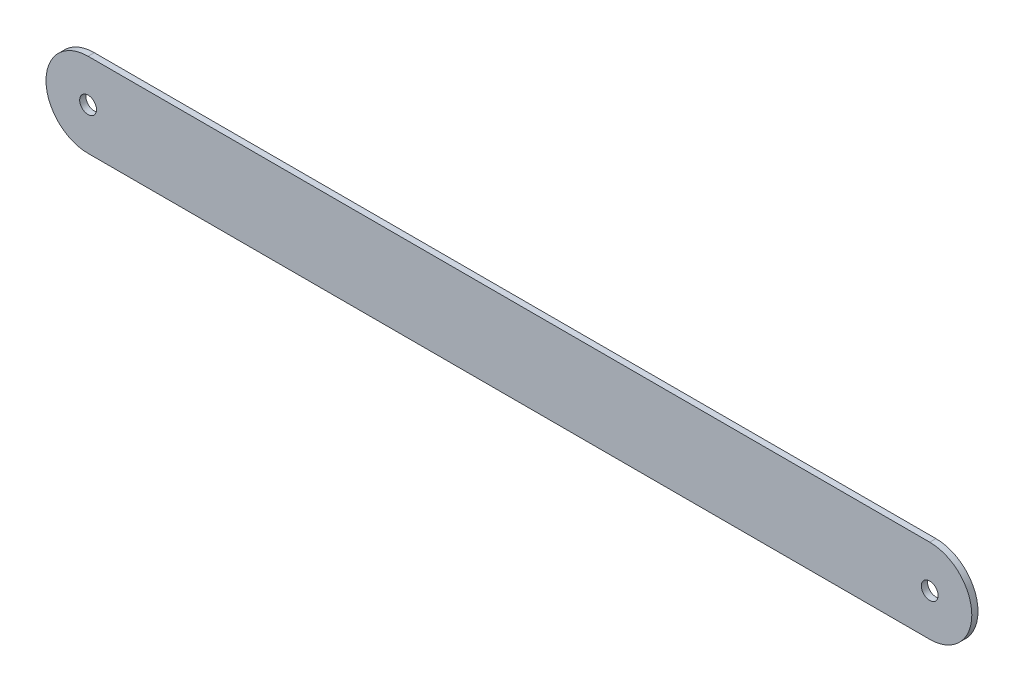
ISO-10303-21;
HEADER;
FILE_DESCRIPTION(('STEP AP214'),'2;1');
FILE_NAME('part.step','',(''),(''),'','','');
FILE_SCHEMA(('AUTOMOTIVE_DESIGN { 1 0 10303 214 1 1 1 1 }'));
ENDSEC;
DATA;
#1=APPLICATION_CONTEXT('core data for automotive mechanical design processes');
#2=APPLICATION_PROTOCOL_DEFINITION('international standard','automotive_design',2000,#1);
#3=PRODUCT_CONTEXT('',#1,'mechanical');
#4=PRODUCT('Part','Part','',(#3));
#5=PRODUCT_RELATED_PRODUCT_CATEGORY('part','',(#4));
#6=PRODUCT_DEFINITION_FORMATION('','',#4);
#7=PRODUCT_DEFINITION_CONTEXT('part definition',#1,'design');
#8=PRODUCT_DEFINITION('design','',#6,#7);
#9=PRODUCT_DEFINITION_SHAPE('','',#8);
#10=(LENGTH_UNIT() NAMED_UNIT(*) SI_UNIT(.MILLI.,.METRE.));
#11=(NAMED_UNIT(*) PLANE_ANGLE_UNIT() SI_UNIT($,.RADIAN.));
#12=(NAMED_UNIT(*) SI_UNIT($,.STERADIAN.) SOLID_ANGLE_UNIT());
#13=UNCERTAINTY_MEASURE_WITH_UNIT(LENGTH_MEASURE(1.E-05),#10,'distance_accuracy_value','');
#14=(GEOMETRIC_REPRESENTATION_CONTEXT(3) GLOBAL_UNCERTAINTY_ASSIGNED_CONTEXT((#13)) GLOBAL_UNIT_ASSIGNED_CONTEXT((#10,
#11,#12)) REPRESENTATION_CONTEXT('',''));
#15=CARTESIAN_POINT('',(0.,0.,0.));
#16=DIRECTION('',(0.,0.,1.));
#17=DIRECTION('',(1.,0.,0.));
#18=AXIS2_PLACEMENT_3D('',#15,#16,#17);
#19=CARTESIAN_POINT('',(-28.3444816053512,0.,-0.7366));
#20=DIRECTION('',(0.,0.,1.));
#21=DIRECTION('',(1.,0.,0.));
#22=AXIS2_PLACEMENT_3D('',#19,#20,#21);
#23=CYLINDRICAL_SURFACE('',#22,5.);
#24=CARTESIAN_POINT('',(-28.3444816053512,0.,0.));
#25=DIRECTION('',(0.,0.,1.));
#26=DIRECTION('',(1.,0.,0.));
#27=AXIS2_PLACEMENT_3D('',#24,#25,#26);
#28=CIRCLE('',#27,5.);
#29=CARTESIAN_POINT('',(-28.3444816053512,5.,0.));
#30=VERTEX_POINT('',#29);
#31=CARTESIAN_POINT('',(-28.3444816053512,-5.,0.));
#32=VERTEX_POINT('',#31);
#33=EDGE_CURVE('E100',#30,#32,#28,.T.);
#34=ORIENTED_EDGE('',*,*,#33,.F.);
#35=DIRECTION('',(0.,0.,1.));
#36=VECTOR('',#35,1.);
#37=CARTESIAN_POINT('',(-28.3444816053512,5.,-0.7366));
#38=LINE('',#37,#36);
#39=CARTESIAN_POINT('',(-28.3444816053512,5.,-0.7366));
#40=VERTEX_POINT('',#39);
#41=EDGE_CURVE('E11',#40,#30,#38,.T.);
#42=ORIENTED_EDGE('',*,*,#41,.F.);
#43=CARTESIAN_POINT('',(-28.3444816053512,0.,-0.7366));
#44=DIRECTION('',(0.,0.,1.));
#45=DIRECTION('',(1.,0.,0.));
#46=AXIS2_PLACEMENT_3D('',#43,#44,#45);
#47=CIRCLE('',#46,5.);
#48=CARTESIAN_POINT('',(-28.3444816053512,-5.,-0.7366));
#49=VERTEX_POINT('',#48);
#50=EDGE_CURVE('E93',#40,#49,#47,.T.);
#51=ORIENTED_EDGE('',*,*,#50,.T.);
#52=DIRECTION('',(0.,0.,1.));
#53=VECTOR('',#52,1.);
#54=CARTESIAN_POINT('',(-28.3444816053512,-5.,-0.7366));
#55=LINE('',#54,#53);
#56=EDGE_CURVE('E38',#49,#32,#55,.T.);
#57=ORIENTED_EDGE('',*,*,#56,.T.);
#58=EDGE_LOOP('',(#34,#42,#51,#57));
#59=FACE_BOUND('',#58,.T.);
#60=ADVANCED_FACE('F35',(#59),#23,.T.);
#61=CARTESIAN_POINT('',(-28.3444816053512,5.,-0.7366));
#62=DIRECTION('',(0.,1.,0.));
#63=DIRECTION('',(0.,0.,1.));
#64=AXIS2_PLACEMENT_3D('',#61,#62,#63);
#65=PLANE('',#64);
#66=DIRECTION('',(-1.,0.,0.));
#67=VECTOR('',#66,1.);
#68=CARTESIAN_POINT('',(-28.3444816053512,5.,0.));
#69=LINE('',#68,#67);
#70=CARTESIAN_POINT('',(71.6555183946488,5.,0.));
#71=VERTEX_POINT('',#70);
#72=EDGE_CURVE('E95',#71,#30,#69,.T.);
#73=ORIENTED_EDGE('',*,*,#72,.F.);
#74=DIRECTION('',(0.,0.,1.));
#75=VECTOR('',#74,1.);
#76=CARTESIAN_POINT('',(71.6555183946488,5.,-0.7366));
#77=LINE('',#76,#75);
#78=CARTESIAN_POINT('',(71.6555183946488,5.,-0.7366));
#79=VERTEX_POINT('',#78);
#80=EDGE_CURVE('E44',#79,#71,#77,.T.);
#81=ORIENTED_EDGE('',*,*,#80,.F.);
#82=DIRECTION('',(-1.,0.,0.));
#83=VECTOR('',#82,1.);
#84=CARTESIAN_POINT('',(-28.3444816053512,5.,-0.7366));
#85=LINE('',#84,#83);
#86=EDGE_CURVE('E90',#79,#40,#85,.T.);
#87=ORIENTED_EDGE('',*,*,#86,.T.);
#88=ORIENTED_EDGE('',*,*,#41,.T.);
#89=EDGE_LOOP('',(#73,#81,#87,#88));
#90=FACE_BOUND('',#89,.T.);
#91=ADVANCED_FACE('F111',(#90),#65,.T.);
#92=CARTESIAN_POINT('',(71.6555183946488,0.,-0.7366));
#93=DIRECTION('',(0.,0.,1.));
#94=DIRECTION('',(1.,0.,0.));
#95=AXIS2_PLACEMENT_3D('',#92,#93,#94);
#96=CYLINDRICAL_SURFACE('',#95,5.);
#97=CARTESIAN_POINT('',(71.6555183946488,0.,0.));
#98=DIRECTION('',(0.,0.,1.));
#99=DIRECTION('',(1.,0.,0.));
#100=AXIS2_PLACEMENT_3D('',#97,#98,#99);
#101=CIRCLE('',#100,5.);
#102=CARTESIAN_POINT('',(71.6555183946488,-5.,0.));
#103=VERTEX_POINT('',#102);
#104=EDGE_CURVE('E85',#103,#71,#101,.T.);
#105=ORIENTED_EDGE('',*,*,#104,.F.);
#106=DIRECTION('',(0.,0.,1.));
#107=VECTOR('',#106,1.);
#108=CARTESIAN_POINT('',(71.6555183946488,-5.,-0.7366));
#109=LINE('',#108,#107);
#110=CARTESIAN_POINT('',(71.6555183946488,-5.,-0.7366));
#111=VERTEX_POINT('',#110);
#112=EDGE_CURVE('E80',#111,#103,#109,.T.);
#113=ORIENTED_EDGE('',*,*,#112,.F.);
#114=CARTESIAN_POINT('',(71.6555183946488,0.,-0.7366));
#115=DIRECTION('',(0.,0.,1.));
#116=DIRECTION('',(1.,0.,0.));
#117=AXIS2_PLACEMENT_3D('',#114,#115,#116);
#118=CIRCLE('',#117,5.);
#119=EDGE_CURVE('E83',#111,#79,#118,.T.);
#120=ORIENTED_EDGE('',*,*,#119,.T.);
#121=ORIENTED_EDGE('',*,*,#80,.T.);
#122=EDGE_LOOP('',(#105,#113,#120,#121));
#123=FACE_BOUND('',#122,.T.);
#124=ADVANCED_FACE('F82',(#123),#96,.T.);
#125=CARTESIAN_POINT('',(-28.3444816053512,-5.,-0.7366));
#126=DIRECTION('',(0.,-1.,0.));
#127=DIRECTION('',(0.,0.,-1.));
#128=AXIS2_PLACEMENT_3D('',#125,#126,#127);
#129=PLANE('',#128);
#130=DIRECTION('',(1.,0.,0.));
#131=VECTOR('',#130,1.);
#132=CARTESIAN_POINT('',(-28.3444816053512,-5.,0.));
#133=LINE('',#132,#131);
#134=EDGE_CURVE('E103',#32,#103,#133,.T.);
#135=ORIENTED_EDGE('',*,*,#134,.F.);
#136=ORIENTED_EDGE('',*,*,#56,.F.);
#137=DIRECTION('',(1.,0.,0.));
#138=VECTOR('',#137,1.);
#139=CARTESIAN_POINT('',(-28.3444816053512,-5.,-0.7366));
#140=LINE('',#139,#138);
#141=EDGE_CURVE('E89',#49,#111,#140,.T.);
#142=ORIENTED_EDGE('',*,*,#141,.T.);
#143=ORIENTED_EDGE('',*,*,#112,.T.);
#144=EDGE_LOOP('',(#135,#136,#142,#143));
#145=FACE_BOUND('',#144,.T.);
#146=ADVANCED_FACE('F92',(#145),#129,.T.);
#147=CARTESIAN_POINT('',(-28.3444816053512,0.,-0.7366));
#148=DIRECTION('',(0.,0.,1.));
#149=DIRECTION('',(1.,0.,0.));
#150=AXIS2_PLACEMENT_3D('',#147,#148,#149);
#151=PLANE('',#150);
#152=CARTESIAN_POINT('',(71.6555183946488,0.,-0.7366));
#153=DIRECTION('',(0.,0.,1.));
#154=DIRECTION('',(1.,0.,0.));
#155=AXIS2_PLACEMENT_3D('',#152,#153,#154);
#156=CIRCLE('',#155,0.999999999999998);
#157=CARTESIAN_POINT('',(72.6555183946488,0.,-0.7366));
#158=VERTEX_POINT('',#157);
#159=EDGE_CURVE('E144',#158,#158,#156,.T.);
#160=ORIENTED_EDGE('',*,*,#159,.T.);
#161=EDGE_LOOP('',(#160));
#162=FACE_BOUND('',#161,.T.);
#163=CARTESIAN_POINT('',(-28.3444816053512,0.,-0.7366));
#164=DIRECTION('',(0.,0.,1.));
#165=DIRECTION('',(1.,0.,0.));
#166=AXIS2_PLACEMENT_3D('',#163,#164,#165);
#167=CIRCLE('',#166,1.);
#168=CARTESIAN_POINT('',(-27.3444816053512,0.,-0.7366));
#169=VERTEX_POINT('',#168);
#170=EDGE_CURVE('E104',#169,#169,#167,.T.);
#171=ORIENTED_EDGE('',*,*,#170,.T.);
#172=EDGE_LOOP('',(#171));
#173=FACE_BOUND('',#172,.T.);
#174=ORIENTED_EDGE('',*,*,#50,.F.);
#175=ORIENTED_EDGE('',*,*,#86,.F.);
#176=ORIENTED_EDGE('',*,*,#119,.F.);
#177=ORIENTED_EDGE('',*,*,#141,.F.);
#178=EDGE_LOOP('',(#174,#175,#176,#177));
#179=FACE_BOUND('',#178,.T.);
#180=ADVANCED_FACE('F88',(#162,#173,#179),#151,.F.);
#181=CARTESIAN_POINT('',(-28.3444816053512,0.,0.));
#182=DIRECTION('',(0.,0.,1.));
#183=DIRECTION('',(1.,0.,0.));
#184=AXIS2_PLACEMENT_3D('',#181,#182,#183);
#185=PLANE('',#184);
#186=CARTESIAN_POINT('',(71.6555183946488,0.,0.));
#187=DIRECTION('',(0.,0.,1.));
#188=DIRECTION('',(1.,0.,0.));
#189=AXIS2_PLACEMENT_3D('',#186,#187,#188);
#190=CIRCLE('',#189,0.999999999999998);
#191=CARTESIAN_POINT('',(72.6555183946488,0.,0.));
#192=VERTEX_POINT('',#191);
#193=EDGE_CURVE('E147',#192,#192,#190,.T.);
#194=ORIENTED_EDGE('',*,*,#193,.F.);
#195=EDGE_LOOP('',(#194));
#196=FACE_BOUND('',#195,.T.);
#197=CARTESIAN_POINT('',(-28.3444816053512,0.,0.));
#198=DIRECTION('',(0.,0.,1.));
#199=DIRECTION('',(1.,0.,0.));
#200=AXIS2_PLACEMENT_3D('',#197,#198,#199);
#201=CIRCLE('',#200,1.);
#202=CARTESIAN_POINT('',(-27.3444816053512,0.,0.));
#203=VERTEX_POINT('',#202);
#204=EDGE_CURVE('E149',#203,#203,#201,.T.);
#205=ORIENTED_EDGE('',*,*,#204,.F.);
#206=EDGE_LOOP('',(#205));
#207=FACE_BOUND('',#206,.T.);
#208=ORIENTED_EDGE('',*,*,#33,.T.);
#209=ORIENTED_EDGE('',*,*,#134,.T.);
#210=ORIENTED_EDGE('',*,*,#104,.T.);
#211=ORIENTED_EDGE('',*,*,#72,.T.);
#212=EDGE_LOOP('',(#208,#209,#210,#211));
#213=FACE_BOUND('',#212,.T.);
#214=ADVANCED_FACE('F110',(#196,#207,#213),#185,.T.);
#215=CARTESIAN_POINT('',(-28.3444816053512,0.,-0.7366));
#216=DIRECTION('',(0.,0.,1.));
#217=DIRECTION('',(1.,0.,0.));
#218=AXIS2_PLACEMENT_3D('',#215,#216,#217);
#219=CYLINDRICAL_SURFACE('',#218,1.);
#220=ORIENTED_EDGE('',*,*,#170,.F.);
#221=EDGE_LOOP('',(#220));
#222=FACE_BOUND('',#221,.T.);
#223=ORIENTED_EDGE('',*,*,#204,.T.);
#224=EDGE_LOOP('',(#223));
#225=FACE_BOUND('',#224,.T.);
#226=ADVANCED_FACE('F129',(#222,#225),#219,.F.);
#227=CARTESIAN_POINT('',(71.6555183946488,0.,-0.7366));
#228=DIRECTION('',(0.,0.,1.));
#229=DIRECTION('',(1.,0.,0.));
#230=AXIS2_PLACEMENT_3D('',#227,#228,#229);
#231=CYLINDRICAL_SURFACE('',#230,0.999999999999998);
#232=ORIENTED_EDGE('',*,*,#159,.F.);
#233=EDGE_LOOP('',(#232));
#234=FACE_BOUND('',#233,.T.);
#235=ORIENTED_EDGE('',*,*,#193,.T.);
#236=EDGE_LOOP('',(#235));
#237=FACE_BOUND('',#236,.T.);
#238=ADVANCED_FACE('F136',(#234,#237),#231,.F.);
#239=CLOSED_SHELL('',(#60,#91,#124,#146,#180,#214,#226,#238));
#240=MANIFOLD_SOLID_BREP('B2',#239);
#241=ADVANCED_BREP_SHAPE_REPRESENTATION('',(#18,#240),#14);
#242=SHAPE_DEFINITION_REPRESENTATION(#9,#241);
ENDSEC;
END-ISO-10303-21;
